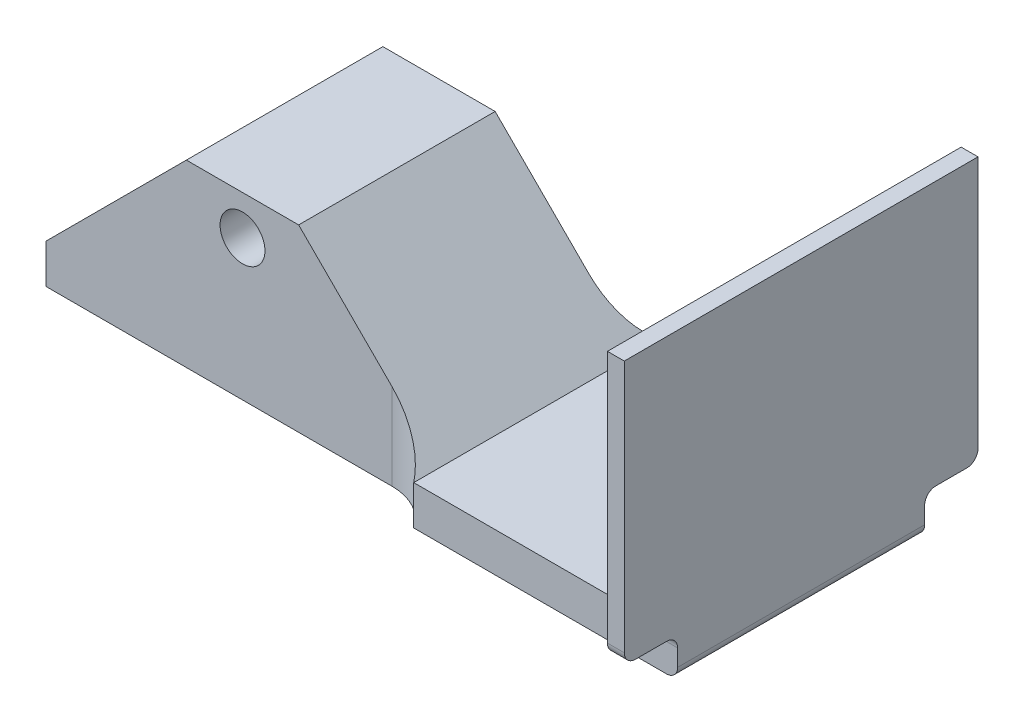
ISO-10303-21;
HEADER;
FILE_DESCRIPTION(('STEP AP214'),'2;1');
FILE_NAME('part.step','',(''),(''),'','','');
FILE_SCHEMA(('AUTOMOTIVE_DESIGN { 1 0 10303 214 1 1 1 1 }'));
ENDSEC;
DATA;
#1=APPLICATION_CONTEXT('core data for automotive mechanical design processes');
#2=APPLICATION_PROTOCOL_DEFINITION('international standard','automotive_design',2000,#1);
#3=PRODUCT_CONTEXT('',#1,'mechanical');
#4=PRODUCT('Part','Part','',(#3));
#5=PRODUCT_RELATED_PRODUCT_CATEGORY('part','',(#4));
#6=PRODUCT_DEFINITION_FORMATION('','',#4);
#7=PRODUCT_DEFINITION_CONTEXT('part definition',#1,'design');
#8=PRODUCT_DEFINITION('design','',#6,#7);
#9=PRODUCT_DEFINITION_SHAPE('','',#8);
#10=(LENGTH_UNIT() NAMED_UNIT(*) SI_UNIT(.MILLI.,.METRE.));
#11=(NAMED_UNIT(*) PLANE_ANGLE_UNIT() SI_UNIT($,.RADIAN.));
#12=(NAMED_UNIT(*) SI_UNIT($,.STERADIAN.) SOLID_ANGLE_UNIT());
#13=UNCERTAINTY_MEASURE_WITH_UNIT(LENGTH_MEASURE(1.E-05),#10,'distance_accuracy_value','');
#14=(GEOMETRIC_REPRESENTATION_CONTEXT(3) GLOBAL_UNCERTAINTY_ASSIGNED_CONTEXT((#13)) GLOBAL_UNIT_ASSIGNED_CONTEXT((#10,
#11,#12)) REPRESENTATION_CONTEXT('',''));
#15=CARTESIAN_POINT('',(0.,0.,0.));
#16=DIRECTION('',(0.,0.,1.));
#17=DIRECTION('',(1.,0.,0.));
#18=AXIS2_PLACEMENT_3D('',#15,#16,#17);
#19=CARTESIAN_POINT('',(82.,6.9999999999999,22.));
#20=DIRECTION('',(0.,-1.,0.));
#21=DIRECTION('',(0.,0.,-1.));
#22=AXIS2_PLACEMENT_3D('',#19,#20,#21);
#23=PLANE('',#22);
#24=DIRECTION('',(0.,0.,1.));
#25=VECTOR('',#24,1.);
#26=CARTESIAN_POINT('',(79.,6.9999999999999,-31.5));
#27=LINE('',#26,#25);
#28=CARTESIAN_POINT('',(79.,6.9999999999999,-22.));
#29=VERTEX_POINT('',#28);
#30=CARTESIAN_POINT('',(79.,6.9999999999999,22.));
#31=VERTEX_POINT('',#30);
#32=EDGE_CURVE('E353',#29,#31,#27,.T.);
#33=ORIENTED_EDGE('',*,*,#32,.F.);
#34=DIRECTION('',(-1.,0.,0.));
#35=VECTOR('',#34,1.);
#36=CARTESIAN_POINT('',(82.,6.9999999999999,-22.));
#37=LINE('',#36,#35);
#38=CARTESIAN_POINT('',(35.,6.9999999999999,-22.));
#39=VERTEX_POINT('',#38);
#40=EDGE_CURVE('E223',#29,#39,#37,.T.);
#41=ORIENTED_EDGE('',*,*,#40,.T.);
#42=DIRECTION('',(0.,0.,1.));
#43=VECTOR('',#42,1.);
#44=CARTESIAN_POINT('',(35.,6.9999999999999,17.5));
#45=LINE('',#44,#43);
#46=CARTESIAN_POINT('',(35.,6.9999999999999,22.));
#47=VERTEX_POINT('',#46);
#48=EDGE_CURVE('E265',#39,#47,#45,.T.);
#49=ORIENTED_EDGE('',*,*,#48,.T.);
#50=DIRECTION('',(-1.,0.,0.));
#51=VECTOR('',#50,1.);
#52=CARTESIAN_POINT('',(82.,6.9999999999999,22.));
#53=LINE('',#52,#51);
#54=EDGE_CURVE('E218',#31,#47,#53,.T.);
#55=ORIENTED_EDGE('',*,*,#54,.F.);
#56=EDGE_LOOP('',(#33,#41,#49,#55));
#57=FACE_BOUND('',#56,.T.);
#58=ADVANCED_FACE('F35',(#57),#23,.F.);
#59=CARTESIAN_POINT('',(-35.,32.,-17.5));
#60=DIRECTION('',(0.,0.,1.));
#61=DIRECTION('',(1.,0.,0.));
#62=AXIS2_PLACEMENT_3D('',#59,#60,#61);
#63=PLANE('',#62);
#64=CARTESIAN_POINT('',(0.,25.,-17.5));
#65=DIRECTION('',(0.,0.,1.));
#66=DIRECTION('',(1.,0.,0.));
#67=AXIS2_PLACEMENT_3D('',#64,#65,#66);
#68=CIRCLE('',#67,4.);
#69=CARTESIAN_POINT('',(4.,25.,-17.5));
#70=VERTEX_POINT('',#69);
#71=EDGE_CURVE('E230',#70,#70,#68,.T.);
#72=ORIENTED_EDGE('',*,*,#71,.T.);
#73=EDGE_LOOP('',(#72));
#74=FACE_BOUND('',#73,.T.);
#75=DIRECTION('',(-0.707106781186546,0.707106781186549,0.));
#76=VECTOR('',#75,1.);
#77=CARTESIAN_POINT('',(9.99999999999999,32.,-17.5));
#78=LINE('',#77,#76);
#79=CARTESIAN_POINT('',(9.99999999999999,32.,-17.5));
#80=VERTEX_POINT('',#79);
#81=CARTESIAN_POINT('',(26.648353455755,15.351646544245,-17.5));
#82=VERTEX_POINT('',#81);
#83=EDGE_CURVE('E262',#80,#82,#78,.F.);
#84=ORIENTED_EDGE('',*,*,#83,.T.);
#85=DIRECTION('',(0.,1.,0.));
#86=VECTOR('',#85,1.);
#87=CARTESIAN_POINT('',(26.648353455755,32.,-17.5));
#88=LINE('',#87,#86);
#89=CARTESIAN_POINT('',(26.648353455755,0.,-17.5));
#90=VERTEX_POINT('',#89);
#91=EDGE_CURVE('E274',#82,#90,#88,.F.);
#92=ORIENTED_EDGE('',*,*,#91,.T.);
#93=DIRECTION('',(-1.,0.,0.));
#94=VECTOR('',#93,1.);
#95=CARTESIAN_POINT('',(-35.,0.,-17.5));
#96=LINE('',#95,#94);
#97=CARTESIAN_POINT('',(-35.,0.,-17.5));
#98=VERTEX_POINT('',#97);
#99=EDGE_CURVE('E233',#90,#98,#96,.T.);
#100=ORIENTED_EDGE('',*,*,#99,.T.);
#101=DIRECTION('',(0.,-1.,0.));
#102=VECTOR('',#101,1.);
#103=CARTESIAN_POINT('',(-35.,32.,-17.5));
#104=LINE('',#103,#102);
#105=CARTESIAN_POINT('',(-35.,6.9999999999999,-17.5));
#106=VERTEX_POINT('',#105);
#107=EDGE_CURVE('E251',#106,#98,#104,.T.);
#108=ORIENTED_EDGE('',*,*,#107,.F.);
#109=DIRECTION('',(-0.707106781186546,-0.707106781186549,0.));
#110=VECTOR('',#109,1.);
#111=CARTESIAN_POINT('',(-9.99999999999999,32.,-17.5));
#112=LINE('',#111,#110);
#113=CARTESIAN_POINT('',(-9.99999999999999,32.,-17.5));
#114=VERTEX_POINT('',#113);
#115=EDGE_CURVE('E260',#106,#114,#112,.F.);
#116=ORIENTED_EDGE('',*,*,#115,.T.);
#117=DIRECTION('',(-1.,0.,0.));
#118=VECTOR('',#117,1.);
#119=CARTESIAN_POINT('',(-35.,32.,-17.5));
#120=LINE('',#119,#118);
#121=EDGE_CURVE('E236',#80,#114,#120,.T.);
#122=ORIENTED_EDGE('',*,*,#121,.F.);
#123=EDGE_LOOP('',(#84,#92,#100,#108,#116,#122));
#124=FACE_BOUND('',#123,.T.);
#125=ADVANCED_FACE('F400',(#74,#124),#63,.F.);
#126=CARTESIAN_POINT('',(-35.,32.,17.5));
#127=DIRECTION('',(1.,0.,0.));
#128=DIRECTION('',(0.,0.,-1.));
#129=AXIS2_PLACEMENT_3D('',#126,#127,#128);
#130=PLANE('',#129);
#131=DIRECTION('',(0.,-1.,0.));
#132=VECTOR('',#131,1.);
#133=CARTESIAN_POINT('',(-35.,32.,17.5));
#134=LINE('',#133,#132);
#135=CARTESIAN_POINT('',(-35.,6.9999999999999,17.5));
#136=VERTEX_POINT('',#135);
#137=CARTESIAN_POINT('',(-35.,0.,17.5));
#138=VERTEX_POINT('',#137);
#139=EDGE_CURVE('E243',#136,#138,#134,.T.);
#140=ORIENTED_EDGE('',*,*,#139,.F.);
#141=DIRECTION('',(0.,0.,-1.));
#142=VECTOR('',#141,1.);
#143=CARTESIAN_POINT('',(-35.,6.9999999999999,17.5));
#144=LINE('',#143,#142);
#145=EDGE_CURVE('E272',#136,#106,#144,.T.);
#146=ORIENTED_EDGE('',*,*,#145,.T.);
#147=ORIENTED_EDGE('',*,*,#107,.T.);
#148=DIRECTION('',(0.,0.,1.));
#149=VECTOR('',#148,1.);
#150=CARTESIAN_POINT('',(-35.,0.,17.5));
#151=LINE('',#150,#149);
#152=EDGE_CURVE('E245',#98,#138,#151,.T.);
#153=ORIENTED_EDGE('',*,*,#152,.T.);
#154=EDGE_LOOP('',(#140,#146,#147,#153));
#155=FACE_BOUND('',#154,.T.);
#156=ADVANCED_FACE('F414',(#155),#130,.F.);
#157=CARTESIAN_POINT('',(-35.,32.,17.5));
#158=DIRECTION('',(0.,0.,-1.));
#159=DIRECTION('',(-1.,0.,0.));
#160=AXIS2_PLACEMENT_3D('',#157,#158,#159);
#161=PLANE('',#160);
#162=CARTESIAN_POINT('',(0.,25.,17.5));
#163=DIRECTION('',(0.,0.,1.));
#164=DIRECTION('',(1.,0.,0.));
#165=AXIS2_PLACEMENT_3D('',#162,#163,#164);
#166=CIRCLE('',#165,4.);
#167=CARTESIAN_POINT('',(4.,25.,17.5));
#168=VERTEX_POINT('',#167);
#169=EDGE_CURVE('E229',#168,#168,#166,.T.);
#170=ORIENTED_EDGE('',*,*,#169,.F.);
#171=EDGE_LOOP('',(#170));
#172=FACE_BOUND('',#171,.T.);
#173=DIRECTION('',(1.,0.,0.));
#174=VECTOR('',#173,1.);
#175=CARTESIAN_POINT('',(-35.,0.,17.5));
#176=LINE('',#175,#174);
#177=CARTESIAN_POINT('',(26.648353455755,0.,17.5));
#178=VERTEX_POINT('',#177);
#179=EDGE_CURVE('E240',#138,#178,#176,.T.);
#180=ORIENTED_EDGE('',*,*,#179,.T.);
#181=DIRECTION('',(0.,-1.,0.));
#182=VECTOR('',#181,1.);
#183=CARTESIAN_POINT('',(26.648353455755,32.,17.5));
#184=LINE('',#183,#182);
#185=CARTESIAN_POINT('',(26.648353455755,15.351646544245,17.5));
#186=VERTEX_POINT('',#185);
#187=EDGE_CURVE('E282',#178,#186,#184,.F.);
#188=ORIENTED_EDGE('',*,*,#187,.T.);
#189=DIRECTION('',(0.707106781186546,-0.707106781186549,0.));
#190=VECTOR('',#189,1.);
#191=CARTESIAN_POINT('',(9.99999999999999,32.,17.5));
#192=LINE('',#191,#190);
#193=CARTESIAN_POINT('',(9.99999999999999,32.,17.5));
#194=VERTEX_POINT('',#193);
#195=EDGE_CURVE('E270',#186,#194,#192,.F.);
#196=ORIENTED_EDGE('',*,*,#195,.T.);
#197=DIRECTION('',(1.,0.,0.));
#198=VECTOR('',#197,1.);
#199=CARTESIAN_POINT('',(-35.,32.,17.5));
#200=LINE('',#199,#198);
#201=CARTESIAN_POINT('',(-9.99999999999999,32.,17.5));
#202=VERTEX_POINT('',#201);
#203=EDGE_CURVE('E239',#202,#194,#200,.T.);
#204=ORIENTED_EDGE('',*,*,#203,.F.);
#205=DIRECTION('',(0.707106781186546,0.707106781186549,0.));
#206=VECTOR('',#205,1.);
#207=CARTESIAN_POINT('',(-9.99999999999999,32.,17.5));
#208=LINE('',#207,#206);
#209=EDGE_CURVE('E268',#202,#136,#208,.F.);
#210=ORIENTED_EDGE('',*,*,#209,.T.);
#211=ORIENTED_EDGE('',*,*,#139,.T.);
#212=EDGE_LOOP('',(#180,#188,#196,#204,#210,#211));
#213=FACE_BOUND('',#212,.T.);
#214=ADVANCED_FACE('F412',(#172,#213),#161,.F.);
#215=CARTESIAN_POINT('',(0.,32.,0.));
#216=DIRECTION('',(0.,-1.,0.));
#217=DIRECTION('',(0.,0.,-1.));
#218=AXIS2_PLACEMENT_3D('',#215,#216,#217);
#219=PLANE('',#218);
#220=ORIENTED_EDGE('',*,*,#203,.T.);
#221=DIRECTION('',(0.,0.,-1.));
#222=VECTOR('',#221,1.);
#223=CARTESIAN_POINT('',(9.99999999999999,32.,0.));
#224=LINE('',#223,#222);
#225=EDGE_CURVE('E257',#194,#80,#224,.T.);
#226=ORIENTED_EDGE('',*,*,#225,.T.);
#227=ORIENTED_EDGE('',*,*,#121,.T.);
#228=DIRECTION('',(0.,0.,1.));
#229=VECTOR('',#228,1.);
#230=CARTESIAN_POINT('',(-9.99999999999999,32.,0.));
#231=LINE('',#230,#229);
#232=EDGE_CURVE('E254',#114,#202,#231,.T.);
#233=ORIENTED_EDGE('',*,*,#232,.T.);
#234=EDGE_LOOP('',(#220,#226,#227,#233));
#235=FACE_BOUND('',#234,.T.);
#236=ADVANCED_FACE('F405',(#235),#219,.F.);
#237=CARTESIAN_POINT('',(0.,0.,0.));
#238=DIRECTION('',(0.,-1.,0.));
#239=DIRECTION('',(0.,0.,-1.));
#240=AXIS2_PLACEMENT_3D('',#237,#238,#239);
#241=PLANE('',#240);
#242=DIRECTION('',(-1.,0.,0.));
#243=VECTOR('',#242,1.);
#244=CARTESIAN_POINT('',(82.,0.,-22.));
#245=LINE('',#244,#243);
#246=CARTESIAN_POINT('',(80.,0.,-22.));
#247=VERTEX_POINT('',#246);
#248=CARTESIAN_POINT('',(35.,0.,-22.));
#249=VERTEX_POINT('',#248);
#250=EDGE_CURVE('E225',#247,#249,#245,.T.);
#251=ORIENTED_EDGE('',*,*,#250,.F.);
#252=DIRECTION('',(0.,0.,-1.));
#253=VECTOR('',#252,1.);
#254=CARTESIAN_POINT('',(80.,0.,22.));
#255=LINE('',#254,#253);
#256=CARTESIAN_POINT('',(80.,0.,22.));
#257=VERTEX_POINT('',#256);
#258=EDGE_CURVE('E300',#247,#257,#255,.F.);
#259=ORIENTED_EDGE('',*,*,#258,.T.);
#260=DIRECTION('',(-1.,0.,0.));
#261=VECTOR('',#260,1.);
#262=CARTESIAN_POINT('',(82.,0.,22.));
#263=LINE('',#262,#261);
#264=CARTESIAN_POINT('',(35.,0.,22.));
#265=VERTEX_POINT('',#264);
#266=EDGE_CURVE('E227',#257,#265,#263,.T.);
#267=ORIENTED_EDGE('',*,*,#266,.T.);
#268=CARTESIAN_POINT('',(26.648353455755,0.,27.5));
#269=DIRECTION('',(0.,-1.,0.));
#270=DIRECTION('',(0.,0.,-1.));
#271=AXIS2_PLACEMENT_3D('',#268,#269,#270);
#272=CIRCLE('',#271,10.);
#273=EDGE_CURVE('E284',#265,#178,#272,.F.);
#274=ORIENTED_EDGE('',*,*,#273,.T.);
#275=ORIENTED_EDGE('',*,*,#179,.F.);
#276=ORIENTED_EDGE('',*,*,#152,.F.);
#277=ORIENTED_EDGE('',*,*,#99,.F.);
#278=CARTESIAN_POINT('',(26.648353455755,0.,-27.5));
#279=DIRECTION('',(0.,-1.,0.));
#280=DIRECTION('',(0.,0.,-1.));
#281=AXIS2_PLACEMENT_3D('',#278,#279,#280);
#282=CIRCLE('',#281,10.);
#283=EDGE_CURVE('E277',#90,#249,#282,.F.);
#284=ORIENTED_EDGE('',*,*,#283,.T.);
#285=EDGE_LOOP('',(#251,#259,#267,#274,#275,#276,#277,#284));
#286=FACE_BOUND('',#285,.T.);
#287=ADVANCED_FACE('F385',(#286),#241,.T.);
#288=CARTESIAN_POINT('',(0.,25.,-17.5));
#289=DIRECTION('',(0.,0.,1.));
#290=DIRECTION('',(1.,0.,0.));
#291=AXIS2_PLACEMENT_3D('',#288,#289,#290);
#292=CYLINDRICAL_SURFACE('',#291,4.);
#293=ORIENTED_EDGE('',*,*,#71,.F.);
#294=EDGE_LOOP('',(#293));
#295=FACE_BOUND('',#294,.T.);
#296=ORIENTED_EDGE('',*,*,#169,.T.);
#297=EDGE_LOOP('',(#296));
#298=FACE_BOUND('',#297,.T.);
#299=ADVANCED_FACE('F438',(#295,#298),#292,.F.);
#300=CARTESIAN_POINT('',(9.99999999999999,32.,0.));
#301=DIRECTION('',(-0.707106781186549,-0.707106781186546,0.));
#302=DIRECTION('',(0.,0.,-1.));
#303=AXIS2_PLACEMENT_3D('',#300,#301,#302);
#304=PLANE('',#303);
#305=ORIENTED_EDGE('',*,*,#195,.F.);
#306=CARTESIAN_POINT('',(26.648353455755,15.351646544245,27.5));
#307=DIRECTION('',(-0.707106781186549,-0.707106781186546,0.));
#308=DIRECTION('',(0.707106781186546,-0.707106781186549,0.));
#309=AXIS2_PLACEMENT_3D('',#306,#307,#308);
#310=ELLIPSE('',#309,14.142135623731,10.);
#311=EDGE_CURVE('E286',#186,#47,#310,.T.);
#312=ORIENTED_EDGE('',*,*,#311,.T.);
#313=ORIENTED_EDGE('',*,*,#48,.F.);
#314=CARTESIAN_POINT('',(26.648353455755,15.351646544245,-27.5));
#315=DIRECTION('',(-0.707106781186549,-0.707106781186546,0.));
#316=DIRECTION('',(-0.707106781186546,0.707106781186549,0.));
#317=AXIS2_PLACEMENT_3D('',#314,#315,#316);
#318=ELLIPSE('',#317,14.142135623731,10.);
#319=EDGE_CURVE('E280',#39,#82,#318,.T.);
#320=ORIENTED_EDGE('',*,*,#319,.T.);
#321=ORIENTED_EDGE('',*,*,#83,.F.);
#322=ORIENTED_EDGE('',*,*,#225,.F.);
#323=EDGE_LOOP('',(#305,#312,#313,#320,#321,#322));
#324=FACE_BOUND('',#323,.T.);
#325=ADVANCED_FACE('F396',(#324),#304,.F.);
#326=CARTESIAN_POINT('',(-9.99999999999999,32.,0.));
#327=DIRECTION('',(0.707106781186549,-0.707106781186546,0.));
#328=DIRECTION('',(0.,0.,1.));
#329=AXIS2_PLACEMENT_3D('',#326,#327,#328);
#330=PLANE('',#329);
#331=ORIENTED_EDGE('',*,*,#115,.F.);
#332=ORIENTED_EDGE('',*,*,#145,.F.);
#333=ORIENTED_EDGE('',*,*,#209,.F.);
#334=ORIENTED_EDGE('',*,*,#232,.F.);
#335=EDGE_LOOP('',(#331,#332,#333,#334));
#336=FACE_BOUND('',#335,.T.);
#337=ADVANCED_FACE('F408',(#336),#330,.F.);
#338=CARTESIAN_POINT('',(82.,0.,22.));
#339=DIRECTION('',(0.,0.,-1.));
#340=DIRECTION('',(0.,1.,0.));
#341=AXIS2_PLACEMENT_3D('',#338,#339,#340);
#342=PLANE('',#341);
#343=ORIENTED_EDGE('',*,*,#266,.F.);
#344=CARTESIAN_POINT('',(80.,2.,22.));
#345=DIRECTION('',(0.,0.,-1.));
#346=DIRECTION('',(0.,1.,0.));
#347=AXIS2_PLACEMENT_3D('',#344,#345,#346);
#348=CIRCLE('',#347,2.);
#349=CARTESIAN_POINT('',(82.,2.,22.));
#350=VERTEX_POINT('',#349);
#351=EDGE_CURVE('E307',#257,#350,#348,.F.);
#352=ORIENTED_EDGE('',*,*,#351,.T.);
#353=DIRECTION('',(0.,-1.,0.));
#354=VECTOR('',#353,1.);
#355=CARTESIAN_POINT('',(82.,0.,22.));
#356=LINE('',#355,#354);
#357=CARTESIAN_POINT('',(82.,4.9999999999999,22.));
#358=VERTEX_POINT('',#357);
#359=EDGE_CURVE('E214',#358,#350,#356,.T.);
#360=ORIENTED_EDGE('',*,*,#359,.F.);
#361=DIRECTION('',(-1.,0.,0.));
#362=VECTOR('',#361,1.);
#363=CARTESIAN_POINT('',(82.,4.9999999999999,22.));
#364=LINE('',#363,#362);
#365=CARTESIAN_POINT('',(79.,4.9999999999999,22.));
#366=VERTEX_POINT('',#365);
#367=EDGE_CURVE('E304',#358,#366,#364,.T.);
#368=ORIENTED_EDGE('',*,*,#367,.T.);
#369=DIRECTION('',(0.,1.,0.));
#370=VECTOR('',#369,1.);
#371=CARTESIAN_POINT('',(79.,54.,22.));
#372=LINE('',#371,#370);
#373=EDGE_CURVE('E302',#366,#31,#372,.T.);
#374=ORIENTED_EDGE('',*,*,#373,.T.);
#375=ORIENTED_EDGE('',*,*,#54,.T.);
#376=DIRECTION('',(0.,-1.,0.));
#377=VECTOR('',#376,1.);
#378=CARTESIAN_POINT('',(35.,0.,22.));
#379=LINE('',#378,#377);
#380=EDGE_CURVE('E205',#47,#265,#379,.T.);
#381=ORIENTED_EDGE('',*,*,#380,.T.);
#382=EDGE_LOOP('',(#343,#352,#360,#368,#374,#375,#381));
#383=FACE_BOUND('',#382,.T.);
#384=ADVANCED_FACE('F378',(#383),#342,.F.);
#385=CARTESIAN_POINT('',(82.,0.,-22.));
#386=DIRECTION('',(0.,0.,1.));
#387=DIRECTION('',(1.,0.,0.));
#388=AXIS2_PLACEMENT_3D('',#385,#386,#387);
#389=PLANE('',#388);
#390=DIRECTION('',(0.,1.,0.));
#391=VECTOR('',#390,1.);
#392=CARTESIAN_POINT('',(82.,0.,-22.));
#393=LINE('',#392,#391);
#394=CARTESIAN_POINT('',(82.,2.,-22.));
#395=VERTEX_POINT('',#394);
#396=CARTESIAN_POINT('',(82.,4.9999999999999,-22.));
#397=VERTEX_POINT('',#396);
#398=EDGE_CURVE('E216',#395,#397,#393,.T.);
#399=ORIENTED_EDGE('',*,*,#398,.F.);
#400=CARTESIAN_POINT('',(80.,2.,-22.));
#401=DIRECTION('',(0.,0.,1.));
#402=DIRECTION('',(1.,0.,0.));
#403=AXIS2_PLACEMENT_3D('',#400,#401,#402);
#404=CIRCLE('',#403,2.);
#405=EDGE_CURVE('E298',#395,#247,#404,.F.);
#406=ORIENTED_EDGE('',*,*,#405,.T.);
#407=ORIENTED_EDGE('',*,*,#250,.T.);
#408=DIRECTION('',(0.,1.,0.));
#409=VECTOR('',#408,1.);
#410=CARTESIAN_POINT('',(35.,0.,-22.));
#411=LINE('',#410,#409);
#412=EDGE_CURVE('E208',#249,#39,#411,.T.);
#413=ORIENTED_EDGE('',*,*,#412,.T.);
#414=ORIENTED_EDGE('',*,*,#40,.F.);
#415=DIRECTION('',(0.,-1.,0.));
#416=VECTOR('',#415,1.);
#417=CARTESIAN_POINT('',(79.,53.9999999999999,-22.));
#418=LINE('',#417,#416);
#419=CARTESIAN_POINT('',(79.,4.9999999999999,-22.));
#420=VERTEX_POINT('',#419);
#421=EDGE_CURVE('E50',#29,#420,#418,.T.);
#422=ORIENTED_EDGE('',*,*,#421,.T.);
#423=DIRECTION('',(-1.,0.,0.));
#424=VECTOR('',#423,1.);
#425=CARTESIAN_POINT('',(82.,4.9999999999999,-22.));
#426=LINE('',#425,#424);
#427=EDGE_CURVE('E295',#420,#397,#426,.F.);
#428=ORIENTED_EDGE('',*,*,#427,.T.);
#429=EDGE_LOOP('',(#399,#406,#407,#413,#414,#422,#428));
#430=FACE_BOUND('',#429,.T.);
#431=ADVANCED_FACE('F338',(#430),#389,.F.);
#432=CARTESIAN_POINT('',(82.,0.,0.));
#433=DIRECTION('',(-1.,0.,0.));
#434=DIRECTION('',(0.,0.,1.));
#435=AXIS2_PLACEMENT_3D('',#432,#433,#434);
#436=PLANE('',#435);
#437=ORIENTED_EDGE('',*,*,#359,.T.);
#438=DIRECTION('',(0.,0.,-1.));
#439=VECTOR('',#438,1.);
#440=CARTESIAN_POINT('',(82.,2.,-22.));
#441=LINE('',#440,#439);
#442=EDGE_CURVE('E292',#350,#395,#441,.T.);
#443=ORIENTED_EDGE('',*,*,#442,.T.);
#444=ORIENTED_EDGE('',*,*,#398,.T.);
#445=CARTESIAN_POINT('',(82.,4.9999999999999,-24.));
#446=DIRECTION('',(-1.,0.,0.));
#447=DIRECTION('',(0.,0.,1.));
#448=AXIS2_PLACEMENT_3D('',#445,#446,#447);
#449=CIRCLE('',#448,2.);
#450=CARTESIAN_POINT('',(82.,6.9999999999999,-24.));
#451=VERTEX_POINT('',#450);
#452=EDGE_CURVE('E11',#397,#451,#449,.T.);
#453=ORIENTED_EDGE('',*,*,#452,.T.);
#454=DIRECTION('',(0.,0.,-1.));
#455=VECTOR('',#454,1.);
#456=CARTESIAN_POINT('',(82.,6.9999999999999,-31.5));
#457=LINE('',#456,#455);
#458=CARTESIAN_POINT('',(82.,6.9999999999999,-29.5));
#459=VERTEX_POINT('',#458);
#460=EDGE_CURVE('E342',#451,#459,#457,.T.);
#461=ORIENTED_EDGE('',*,*,#460,.T.);
#462=CARTESIAN_POINT('',(82.,8.9999999999999,-29.5));
#463=DIRECTION('',(-1.,0.,0.));
#464=DIRECTION('',(0.,0.,1.));
#465=AXIS2_PLACEMENT_3D('',#462,#463,#464);
#466=CIRCLE('',#465,2.);
#467=CARTESIAN_POINT('',(82.,8.9999999999999,-31.5));
#468=VERTEX_POINT('',#467);
#469=EDGE_CURVE('E204',#459,#468,#466,.F.);
#470=ORIENTED_EDGE('',*,*,#469,.T.);
#471=DIRECTION('',(0.,-1.,0.));
#472=VECTOR('',#471,1.);
#473=CARTESIAN_POINT('',(82.,53.9999999999999,-31.5));
#474=LINE('',#473,#472);
#475=CARTESIAN_POINT('',(82.,53.9999999999999,-31.5));
#476=VERTEX_POINT('',#475);
#477=EDGE_CURVE('E183',#476,#468,#474,.T.);
#478=ORIENTED_EDGE('',*,*,#477,.F.);
#479=DIRECTION('',(0.,0.,-1.));
#480=VECTOR('',#479,1.);
#481=CARTESIAN_POINT('',(82.,53.9999999999999,-31.5));
#482=LINE('',#481,#480);
#483=CARTESIAN_POINT('',(82.,53.9999999999999,31.5));
#484=VERTEX_POINT('',#483);
#485=EDGE_CURVE('E189',#484,#476,#482,.T.);
#486=ORIENTED_EDGE('',*,*,#485,.F.);
#487=DIRECTION('',(0.,-1.,0.));
#488=VECTOR('',#487,1.);
#489=CARTESIAN_POINT('',(82.,53.9999999999999,31.5));
#490=LINE('',#489,#488);
#491=CARTESIAN_POINT('',(82.,8.9999999999999,31.5));
#492=VERTEX_POINT('',#491);
#493=EDGE_CURVE('E354',#484,#492,#490,.T.);
#494=ORIENTED_EDGE('',*,*,#493,.T.);
#495=CARTESIAN_POINT('',(82.,8.9999999999999,29.5));
#496=DIRECTION('',(-1.,0.,0.));
#497=DIRECTION('',(0.,0.,1.));
#498=AXIS2_PLACEMENT_3D('',#495,#496,#497);
#499=CIRCLE('',#498,2.);
#500=CARTESIAN_POINT('',(82.,6.9999999999999,29.5));
#501=VERTEX_POINT('',#500);
#502=EDGE_CURVE('E290',#492,#501,#499,.F.);
#503=ORIENTED_EDGE('',*,*,#502,.T.);
#504=CARTESIAN_POINT('',(82.,6.9999999999999,24.));
#505=VERTEX_POINT('',#504);
#506=EDGE_CURVE('E345',#501,#505,#457,.T.);
#507=ORIENTED_EDGE('',*,*,#506,.T.);
#508=CARTESIAN_POINT('',(82.,4.9999999999999,24.));
#509=DIRECTION('',(-1.,0.,0.));
#510=DIRECTION('',(0.,0.,1.));
#511=AXIS2_PLACEMENT_3D('',#508,#509,#510);
#512=CIRCLE('',#511,2.);
#513=EDGE_CURVE('E328',#505,#358,#512,.T.);
#514=ORIENTED_EDGE('',*,*,#513,.T.);
#515=EDGE_LOOP('',(#437,#443,#444,#453,#461,#470,#478,#486,#494,#503,#507,#514));
#516=FACE_BOUND('',#515,.T.);
#517=ADVANCED_FACE('F201',(#516),#436,.F.);
#518=CARTESIAN_POINT('',(26.648353455755,0.,-27.5));
#519=DIRECTION('',(0.,1.,0.));
#520=DIRECTION('',(0.,0.,1.));
#521=AXIS2_PLACEMENT_3D('',#518,#519,#520);
#522=CYLINDRICAL_SURFACE('',#521,10.);
#523=ORIENTED_EDGE('',*,*,#319,.F.);
#524=ORIENTED_EDGE('',*,*,#412,.F.);
#525=ORIENTED_EDGE('',*,*,#283,.F.);
#526=ORIENTED_EDGE('',*,*,#91,.F.);
#527=EDGE_LOOP('',(#523,#524,#525,#526));
#528=FACE_BOUND('',#527,.T.);
#529=ADVANCED_FACE('F392',(#528),#522,.F.);
#530=CARTESIAN_POINT('',(26.648353455755,0.,27.5));
#531=DIRECTION('',(0.,-1.,0.));
#532=DIRECTION('',(0.,0.,-1.));
#533=AXIS2_PLACEMENT_3D('',#530,#531,#532);
#534=CYLINDRICAL_SURFACE('',#533,10.);
#535=ORIENTED_EDGE('',*,*,#311,.F.);
#536=ORIENTED_EDGE('',*,*,#187,.F.);
#537=ORIENTED_EDGE('',*,*,#273,.F.);
#538=ORIENTED_EDGE('',*,*,#380,.F.);
#539=EDGE_LOOP('',(#535,#536,#537,#538));
#540=FACE_BOUND('',#539,.T.);
#541=ADVANCED_FACE('F420',(#540),#534,.F.);
#542=CARTESIAN_POINT('',(0.,6.9999999999999,0.));
#543=DIRECTION('',(0.,-1.,0.));
#544=DIRECTION('',(0.,0.,-1.));
#545=AXIS2_PLACEMENT_3D('',#542,#543,#544);
#546=PLANE('',#545);
#547=ORIENTED_EDGE('',*,*,#506,.F.);
#548=DIRECTION('',(1.,0.,0.));
#549=VECTOR('',#548,1.);
#550=CARTESIAN_POINT('',(79.,6.9999999999999,29.5));
#551=LINE('',#550,#549);
#552=CARTESIAN_POINT('',(79.,6.9999999999999,29.5));
#553=VERTEX_POINT('',#552);
#554=EDGE_CURVE('E314',#501,#553,#551,.F.);
#555=ORIENTED_EDGE('',*,*,#554,.T.);
#556=CARTESIAN_POINT('',(79.,6.9999999999999,24.));
#557=VERTEX_POINT('',#556);
#558=EDGE_CURVE('E348',#557,#553,#27,.T.);
#559=ORIENTED_EDGE('',*,*,#558,.F.);
#560=DIRECTION('',(-1.,0.,0.));
#561=VECTOR('',#560,1.);
#562=CARTESIAN_POINT('',(0.,6.9999999999999,24.));
#563=LINE('',#562,#561);
#564=EDGE_CURVE('E312',#557,#505,#563,.F.);
#565=ORIENTED_EDGE('',*,*,#564,.T.);
#566=EDGE_LOOP('',(#547,#555,#559,#565));
#567=FACE_BOUND('',#566,.T.);
#568=ADVANCED_FACE('F367',(#567),#546,.T.);
#569=CARTESIAN_POINT('',(79.,6.9999999999999,-29.5));
#570=VERTEX_POINT('',#569);
#571=CARTESIAN_POINT('',(79.,6.9999999999999,-24.));
#572=VERTEX_POINT('',#571);
#573=EDGE_CURVE('E198',#570,#572,#27,.T.);
#574=ORIENTED_EDGE('',*,*,#573,.F.);
#575=DIRECTION('',(-1.,0.,0.));
#576=VECTOR('',#575,1.);
#577=CARTESIAN_POINT('',(82.,6.9999999999999,-29.5));
#578=LINE('',#577,#576);
#579=EDGE_CURVE('E324',#570,#459,#578,.F.);
#580=ORIENTED_EDGE('',*,*,#579,.T.);
#581=ORIENTED_EDGE('',*,*,#460,.F.);
#582=DIRECTION('',(-1.,0.,0.));
#583=VECTOR('',#582,1.);
#584=CARTESIAN_POINT('',(0.,6.9999999999999,-24.));
#585=LINE('',#584,#583);
#586=EDGE_CURVE('E321',#451,#572,#585,.T.);
#587=ORIENTED_EDGE('',*,*,#586,.T.);
#588=EDGE_LOOP('',(#574,#580,#581,#587));
#589=FACE_BOUND('',#588,.T.);
#590=ADVANCED_FACE('F344',(#589),#546,.T.);
#591=CARTESIAN_POINT('',(82.,53.9999999999999,-31.5));
#592=DIRECTION('',(0.,0.,1.));
#593=DIRECTION('',(1.,0.,0.));
#594=AXIS2_PLACEMENT_3D('',#591,#592,#593);
#595=PLANE('',#594);
#596=ORIENTED_EDGE('',*,*,#477,.T.);
#597=DIRECTION('',(-1.,0.,0.));
#598=VECTOR('',#597,1.);
#599=CARTESIAN_POINT('',(79.,8.9999999999999,-31.5));
#600=LINE('',#599,#598);
#601=CARTESIAN_POINT('',(79.,8.9999999999999,-31.5));
#602=VERTEX_POINT('',#601);
#603=EDGE_CURVE('E319',#468,#602,#600,.T.);
#604=ORIENTED_EDGE('',*,*,#603,.T.);
#605=DIRECTION('',(0.,-1.,0.));
#606=VECTOR('',#605,1.);
#607=CARTESIAN_POINT('',(79.,53.9999999999999,-31.5));
#608=LINE('',#607,#606);
#609=CARTESIAN_POINT('',(79.,53.9999999999999,-31.5));
#610=VERTEX_POINT('',#609);
#611=EDGE_CURVE('E185',#610,#602,#608,.T.);
#612=ORIENTED_EDGE('',*,*,#611,.F.);
#613=DIRECTION('',(-1.,0.,0.));
#614=VECTOR('',#613,1.);
#615=CARTESIAN_POINT('',(82.,53.9999999999999,-31.5));
#616=LINE('',#615,#614);
#617=EDGE_CURVE('E179',#476,#610,#616,.T.);
#618=ORIENTED_EDGE('',*,*,#617,.F.);
#619=EDGE_LOOP('',(#596,#604,#612,#618));
#620=FACE_BOUND('',#619,.T.);
#621=ADVANCED_FACE('F181',(#620),#595,.F.);
#622=CARTESIAN_POINT('',(79.,53.9999999999999,-31.5));
#623=DIRECTION('',(1.,0.,0.));
#624=DIRECTION('',(0.,0.,-1.));
#625=AXIS2_PLACEMENT_3D('',#622,#623,#624);
#626=PLANE('',#625);
#627=ORIENTED_EDGE('',*,*,#558,.T.);
#628=CARTESIAN_POINT('',(79.,8.9999999999999,29.5));
#629=DIRECTION('',(1.,0.,0.));
#630=DIRECTION('',(0.,0.,-1.));
#631=AXIS2_PLACEMENT_3D('',#628,#629,#630);
#632=CIRCLE('',#631,2.);
#633=CARTESIAN_POINT('',(79.,8.9999999999999,31.5));
#634=VERTEX_POINT('',#633);
#635=EDGE_CURVE('E317',#553,#634,#632,.F.);
#636=ORIENTED_EDGE('',*,*,#635,.T.);
#637=DIRECTION('',(0.,-1.,0.));
#638=VECTOR('',#637,1.);
#639=CARTESIAN_POINT('',(79.,53.9999999999999,31.5));
#640=LINE('',#639,#638);
#641=CARTESIAN_POINT('',(79.,53.9999999999999,31.5));
#642=VERTEX_POINT('',#641);
#643=EDGE_CURVE('E210',#642,#634,#640,.T.);
#644=ORIENTED_EDGE('',*,*,#643,.F.);
#645=DIRECTION('',(0.,0.,1.));
#646=VECTOR('',#645,1.);
#647=CARTESIAN_POINT('',(79.,53.9999999999999,-31.5));
#648=LINE('',#647,#646);
#649=EDGE_CURVE('E188',#610,#642,#648,.T.);
#650=ORIENTED_EDGE('',*,*,#649,.F.);
#651=ORIENTED_EDGE('',*,*,#611,.T.);
#652=CARTESIAN_POINT('',(79.,8.9999999999999,-29.5));
#653=DIRECTION('',(1.,0.,0.));
#654=DIRECTION('',(0.,0.,-1.));
#655=AXIS2_PLACEMENT_3D('',#652,#653,#654);
#656=CIRCLE('',#655,2.);
#657=EDGE_CURVE('E58',#602,#570,#656,.F.);
#658=ORIENTED_EDGE('',*,*,#657,.T.);
#659=ORIENTED_EDGE('',*,*,#573,.T.);
#660=CARTESIAN_POINT('',(79.,4.9999999999999,-24.));
#661=DIRECTION('',(1.,0.,0.));
#662=DIRECTION('',(0.,0.,-1.));
#663=AXIS2_PLACEMENT_3D('',#660,#661,#662);
#664=CIRCLE('',#663,2.);
#665=EDGE_CURVE('E43',#572,#420,#664,.T.);
#666=ORIENTED_EDGE('',*,*,#665,.T.);
#667=ORIENTED_EDGE('',*,*,#421,.F.);
#668=ORIENTED_EDGE('',*,*,#32,.T.);
#669=ORIENTED_EDGE('',*,*,#373,.F.);
#670=CARTESIAN_POINT('',(79.,4.9999999999999,24.));
#671=DIRECTION('',(1.,0.,0.));
#672=DIRECTION('',(0.,0.,-1.));
#673=AXIS2_PLACEMENT_3D('',#670,#671,#672);
#674=CIRCLE('',#673,2.);
#675=EDGE_CURVE('E326',#366,#557,#674,.T.);
#676=ORIENTED_EDGE('',*,*,#675,.T.);
#677=EDGE_LOOP('',(#627,#636,#644,#650,#651,#658,#659,#666,#667,#668,#669,#676));
#678=FACE_BOUND('',#677,.T.);
#679=ADVANCED_FACE('F331',(#678),#626,.F.);
#680=CARTESIAN_POINT('',(82.,53.9999999999999,31.5));
#681=DIRECTION('',(0.,0.,-1.));
#682=DIRECTION('',(-1.,0.,0.));
#683=AXIS2_PLACEMENT_3D('',#680,#681,#682);
#684=PLANE('',#683);
#685=ORIENTED_EDGE('',*,*,#643,.T.);
#686=DIRECTION('',(1.,0.,0.));
#687=VECTOR('',#686,1.);
#688=CARTESIAN_POINT('',(82.,8.9999999999999,31.5));
#689=LINE('',#688,#687);
#690=EDGE_CURVE('E309',#634,#492,#689,.T.);
#691=ORIENTED_EDGE('',*,*,#690,.T.);
#692=ORIENTED_EDGE('',*,*,#493,.F.);
#693=DIRECTION('',(1.,0.,0.));
#694=VECTOR('',#693,1.);
#695=CARTESIAN_POINT('',(82.,53.9999999999999,31.5));
#696=LINE('',#695,#694);
#697=EDGE_CURVE('E194',#642,#484,#696,.T.);
#698=ORIENTED_EDGE('',*,*,#697,.F.);
#699=EDGE_LOOP('',(#685,#691,#692,#698));
#700=FACE_BOUND('',#699,.T.);
#701=ADVANCED_FACE('F359',(#700),#684,.F.);
#702=CARTESIAN_POINT('',(0.,53.9999999999999,0.));
#703=DIRECTION('',(0.,-1.,0.));
#704=DIRECTION('',(0.,0.,-1.));
#705=AXIS2_PLACEMENT_3D('',#702,#703,#704);
#706=PLANE('',#705);
#707=ORIENTED_EDGE('',*,*,#485,.T.);
#708=ORIENTED_EDGE('',*,*,#617,.T.);
#709=ORIENTED_EDGE('',*,*,#649,.T.);
#710=ORIENTED_EDGE('',*,*,#697,.T.);
#711=EDGE_LOOP('',(#707,#708,#709,#710));
#712=FACE_BOUND('',#711,.T.);
#713=ADVANCED_FACE('F192',(#712),#706,.F.);
#714=CARTESIAN_POINT('',(80.,2.,0.));
#715=DIRECTION('',(0.,0.,1.));
#716=DIRECTION('',(1.,0.,0.));
#717=AXIS2_PLACEMENT_3D('',#714,#715,#716);
#718=CYLINDRICAL_SURFACE('',#717,2.);
#719=ORIENTED_EDGE('',*,*,#351,.F.);
#720=ORIENTED_EDGE('',*,*,#258,.F.);
#721=ORIENTED_EDGE('',*,*,#405,.F.);
#722=ORIENTED_EDGE('',*,*,#442,.F.);
#723=EDGE_LOOP('',(#719,#720,#721,#722));
#724=FACE_BOUND('',#723,.T.);
#725=ADVANCED_FACE('F382',(#724),#718,.T.);
#726=CARTESIAN_POINT('',(82.,8.9999999999999,29.5));
#727=DIRECTION('',(-1.,0.,0.));
#728=DIRECTION('',(0.,0.,1.));
#729=AXIS2_PLACEMENT_3D('',#726,#727,#728);
#730=CYLINDRICAL_SURFACE('',#729,2.);
#731=ORIENTED_EDGE('',*,*,#635,.F.);
#732=ORIENTED_EDGE('',*,*,#554,.F.);
#733=ORIENTED_EDGE('',*,*,#502,.F.);
#734=ORIENTED_EDGE('',*,*,#690,.F.);
#735=EDGE_LOOP('',(#731,#732,#733,#734));
#736=FACE_BOUND('',#735,.T.);
#737=ADVANCED_FACE('F362',(#736),#730,.T.);
#738=CARTESIAN_POINT('',(82.,4.9999999999999,24.));
#739=DIRECTION('',(-1.,0.,0.));
#740=DIRECTION('',(0.,0.,1.));
#741=AXIS2_PLACEMENT_3D('',#738,#739,#740);
#742=CYLINDRICAL_SURFACE('',#741,2.);
#743=ORIENTED_EDGE('',*,*,#513,.F.);
#744=ORIENTED_EDGE('',*,*,#564,.F.);
#745=ORIENTED_EDGE('',*,*,#675,.F.);
#746=ORIENTED_EDGE('',*,*,#367,.F.);
#747=EDGE_LOOP('',(#743,#744,#745,#746));
#748=FACE_BOUND('',#747,.T.);
#749=ADVANCED_FACE('F371',(#748),#742,.F.);
#750=CARTESIAN_POINT('',(82.,8.9999999999999,-29.5));
#751=DIRECTION('',(1.,0.,0.));
#752=DIRECTION('',(0.,0.,-1.));
#753=AXIS2_PLACEMENT_3D('',#750,#751,#752);
#754=CYLINDRICAL_SURFACE('',#753,2.);
#755=ORIENTED_EDGE('',*,*,#469,.F.);
#756=ORIENTED_EDGE('',*,*,#579,.F.);
#757=ORIENTED_EDGE('',*,*,#657,.F.);
#758=ORIENTED_EDGE('',*,*,#603,.F.);
#759=EDGE_LOOP('',(#755,#756,#757,#758));
#760=FACE_BOUND('',#759,.T.);
#761=ADVANCED_FACE('F470',(#760),#754,.T.);
#762=CARTESIAN_POINT('',(0.,4.9999999999999,-24.));
#763=DIRECTION('',(-1.,0.,0.));
#764=DIRECTION('',(0.,0.,1.));
#765=AXIS2_PLACEMENT_3D('',#762,#763,#764);
#766=CYLINDRICAL_SURFACE('',#765,2.);
#767=ORIENTED_EDGE('',*,*,#452,.F.);
#768=ORIENTED_EDGE('',*,*,#427,.F.);
#769=ORIENTED_EDGE('',*,*,#665,.F.);
#770=ORIENTED_EDGE('',*,*,#586,.F.);
#771=EDGE_LOOP('',(#767,#768,#769,#770));
#772=FACE_BOUND('',#771,.T.);
#773=ADVANCED_FACE('F37',(#772),#766,.F.);
#774=CLOSED_SHELL('',(#58,#125,#156,#214,#236,#287,#299,#325,#337,#384,#431,#517,#529,#541,#568,
#590,#621,#679,#701,#713,#725,#737,#749,#761,#773));
#775=MANIFOLD_SOLID_BREP('B2',#774);
#776=ADVANCED_BREP_SHAPE_REPRESENTATION('',(#18,#775),#14);
#777=SHAPE_DEFINITION_REPRESENTATION(#9,#776);
ENDSEC;
END-ISO-10303-21;
